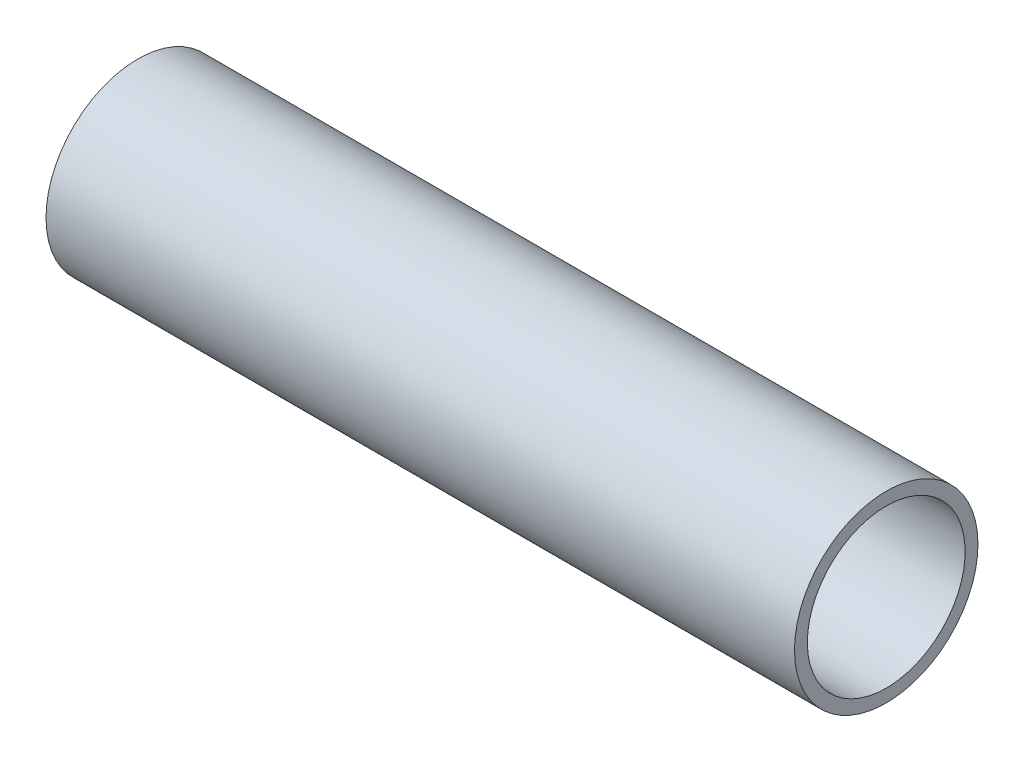
ISO-10303-21;
HEADER;
FILE_DESCRIPTION(('STEP AP214'),'2;1');
FILE_NAME('part.step','',(''),(''),'','','');
FILE_SCHEMA(('AUTOMOTIVE_DESIGN { 1 0 10303 214 1 1 1 1 }'));
ENDSEC;
DATA;
#1=APPLICATION_CONTEXT('core data for automotive mechanical design processes');
#2=APPLICATION_PROTOCOL_DEFINITION('international standard','automotive_design',2000,#1);
#3=PRODUCT_CONTEXT('',#1,'mechanical');
#4=PRODUCT('Part','Part','',(#3));
#5=PRODUCT_RELATED_PRODUCT_CATEGORY('part','',(#4));
#6=PRODUCT_DEFINITION_FORMATION('','',#4);
#7=PRODUCT_DEFINITION_CONTEXT('part definition',#1,'design');
#8=PRODUCT_DEFINITION('design','',#6,#7);
#9=PRODUCT_DEFINITION_SHAPE('','',#8);
#10=(LENGTH_UNIT() NAMED_UNIT(*) SI_UNIT(.MILLI.,.METRE.));
#11=(NAMED_UNIT(*) PLANE_ANGLE_UNIT() SI_UNIT($,.RADIAN.));
#12=(NAMED_UNIT(*) SI_UNIT($,.STERADIAN.) SOLID_ANGLE_UNIT());
#13=UNCERTAINTY_MEASURE_WITH_UNIT(LENGTH_MEASURE(1.E-05),#10,'distance_accuracy_value','');
#14=(GEOMETRIC_REPRESENTATION_CONTEXT(3) GLOBAL_UNCERTAINTY_ASSIGNED_CONTEXT((#13)) GLOBAL_UNIT_ASSIGNED_CONTEXT((#10,
#11,#12)) REPRESENTATION_CONTEXT('',''));
#15=CARTESIAN_POINT('',(0.,0.,0.));
#16=DIRECTION('',(0.,0.,1.));
#17=DIRECTION('',(1.,0.,0.));
#18=AXIS2_PLACEMENT_3D('',#15,#16,#17);
#19=CARTESIAN_POINT('',(-1000.,0.,0.));
#20=DIRECTION('',(-1.,0.,0.));
#21=DIRECTION('',(0.,0.,1.));
#22=AXIS2_PLACEMENT_3D('',#19,#20,#21);
#23=CYLINDRICAL_SURFACE('',#22,5.461);
#24=CARTESIAN_POINT('',(25.9,0.,0.));
#25=DIRECTION('',(-1.,0.,0.));
#26=DIRECTION('',(0.,0.,1.));
#27=AXIS2_PLACEMENT_3D('',#24,#25,#26);
#28=CIRCLE('',#27,5.461);
#29=CARTESIAN_POINT('',(25.9,0.,5.461));
#30=VERTEX_POINT('',#29);
#31=EDGE_CURVE('E52',#30,#30,#28,.T.);
#32=ORIENTED_EDGE('',*,*,#31,.F.);
#33=EDGE_LOOP('',(#32));
#34=FACE_BOUND('',#33,.T.);
#35=CARTESIAN_POINT('',(-25.9,0.,0.));
#36=DIRECTION('',(-1.,0.,0.));
#37=DIRECTION('',(0.,0.,1.));
#38=AXIS2_PLACEMENT_3D('',#35,#36,#37);
#39=CIRCLE('',#38,5.461);
#40=CARTESIAN_POINT('',(-25.9,0.,5.461));
#41=VERTEX_POINT('',#40);
#42=EDGE_CURVE('E10',#41,#41,#39,.T.);
#43=ORIENTED_EDGE('',*,*,#42,.T.);
#44=EDGE_LOOP('',(#43));
#45=FACE_BOUND('',#44,.T.);
#46=ADVANCED_FACE('F39',(#34,#45),#23,.F.);
#47=CARTESIAN_POINT('',(-25.9,5.461,0.));
#48=DIRECTION('',(1.,0.,0.));
#49=DIRECTION('',(0.,0.,-1.));
#50=AXIS2_PLACEMENT_3D('',#47,#48,#49);
#51=PLANE('',#50);
#52=ORIENTED_EDGE('',*,*,#42,.F.);
#53=EDGE_LOOP('',(#52));
#54=FACE_BOUND('',#53,.T.);
#55=CARTESIAN_POINT('',(-25.9,0.,0.));
#56=DIRECTION('',(-1.,0.,0.));
#57=DIRECTION('',(0.,0.,1.));
#58=AXIS2_PLACEMENT_3D('',#55,#56,#57);
#59=CIRCLE('',#58,6.35);
#60=CARTESIAN_POINT('',(-25.9,0.,6.35));
#61=VERTEX_POINT('',#60);
#62=EDGE_CURVE('E44',#61,#61,#59,.T.);
#63=ORIENTED_EDGE('',*,*,#62,.T.);
#64=EDGE_LOOP('',(#63));
#65=FACE_BOUND('',#64,.T.);
#66=ADVANCED_FACE('F65',(#54,#65),#51,.F.);
#67=CARTESIAN_POINT('',(-1000.,0.,0.));
#68=DIRECTION('',(-1.,0.,0.));
#69=DIRECTION('',(0.,0.,1.));
#70=AXIS2_PLACEMENT_3D('',#67,#68,#69);
#71=CYLINDRICAL_SURFACE('',#70,6.35);
#72=ORIENTED_EDGE('',*,*,#62,.F.);
#73=EDGE_LOOP('',(#72));
#74=FACE_BOUND('',#73,.T.);
#75=CARTESIAN_POINT('',(25.9,0.,0.));
#76=DIRECTION('',(-1.,0.,0.));
#77=DIRECTION('',(0.,0.,1.));
#78=AXIS2_PLACEMENT_3D('',#75,#76,#77);
#79=CIRCLE('',#78,6.35);
#80=CARTESIAN_POINT('',(25.9,0.,6.35));
#81=VERTEX_POINT('',#80);
#82=EDGE_CURVE('E47',#81,#81,#79,.T.);
#83=ORIENTED_EDGE('',*,*,#82,.T.);
#84=EDGE_LOOP('',(#83));
#85=FACE_BOUND('',#84,.T.);
#86=ADVANCED_FACE('F66',(#74,#85),#71,.T.);
#87=CARTESIAN_POINT('',(25.9,6.35,0.));
#88=DIRECTION('',(-1.,0.,0.));
#89=DIRECTION('',(0.,0.,1.));
#90=AXIS2_PLACEMENT_3D('',#87,#88,#89);
#91=PLANE('',#90);
#92=ORIENTED_EDGE('',*,*,#82,.F.);
#93=EDGE_LOOP('',(#92));
#94=FACE_BOUND('',#93,.T.);
#95=ORIENTED_EDGE('',*,*,#31,.T.);
#96=EDGE_LOOP('',(#95));
#97=FACE_BOUND('',#96,.T.);
#98=ADVANCED_FACE('F56',(#94,#97),#91,.F.);
#99=CLOSED_SHELL('',(#46,#66,#86,#98));
#100=MANIFOLD_SOLID_BREP('B2',#99);
#101=ADVANCED_BREP_SHAPE_REPRESENTATION('',(#18,#100),#14);
#102=SHAPE_DEFINITION_REPRESENTATION(#9,#101);
ENDSEC;
END-ISO-10303-21;
